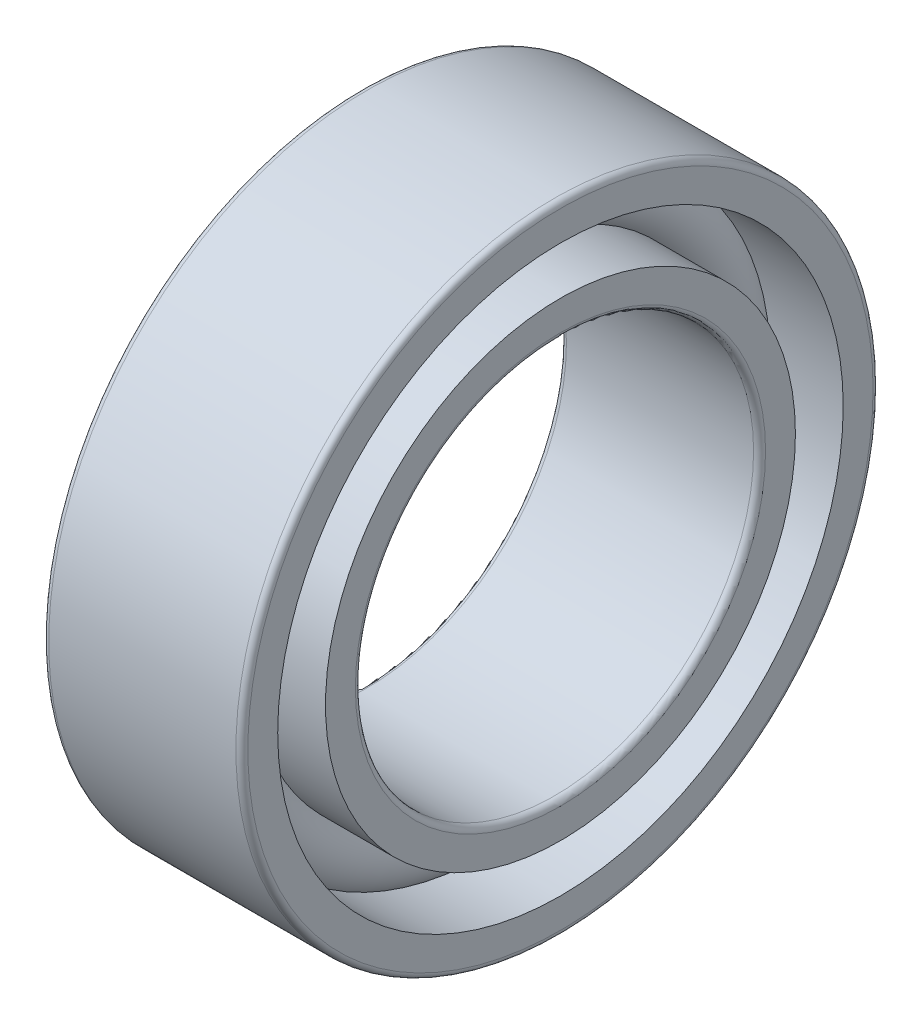
ISO-10303-21;
HEADER;
FILE_DESCRIPTION(('STEP AP214'),'2;1');
FILE_NAME('part.step','',(''),(''),'','','');
FILE_SCHEMA(('AUTOMOTIVE_DESIGN { 1 0 10303 214 1 1 1 1 }'));
ENDSEC;
DATA;
#1=APPLICATION_CONTEXT('core data for automotive mechanical design processes');
#2=APPLICATION_PROTOCOL_DEFINITION('international standard','automotive_design',2000,#1);
#3=PRODUCT_CONTEXT('',#1,'mechanical');
#4=PRODUCT('Part','Part','',(#3));
#5=PRODUCT_RELATED_PRODUCT_CATEGORY('part','',(#4));
#6=PRODUCT_DEFINITION_FORMATION('','',#4);
#7=PRODUCT_DEFINITION_CONTEXT('part definition',#1,'design');
#8=PRODUCT_DEFINITION('design','',#6,#7);
#9=PRODUCT_DEFINITION_SHAPE('','',#8);
#10=(LENGTH_UNIT() NAMED_UNIT(*) SI_UNIT(.MILLI.,.METRE.));
#11=(NAMED_UNIT(*) PLANE_ANGLE_UNIT() SI_UNIT($,.RADIAN.));
#12=(NAMED_UNIT(*) SI_UNIT($,.STERADIAN.) SOLID_ANGLE_UNIT());
#13=UNCERTAINTY_MEASURE_WITH_UNIT(LENGTH_MEASURE(1.E-05),#10,'distance_accuracy_value','');
#14=(GEOMETRIC_REPRESENTATION_CONTEXT(3) GLOBAL_UNCERTAINTY_ASSIGNED_CONTEXT((#13)) GLOBAL_UNIT_ASSIGNED_CONTEXT((#10,
#11,#12)) REPRESENTATION_CONTEXT('',''));
#15=CARTESIAN_POINT('',(0.,0.,0.));
#16=DIRECTION('',(0.,0.,1.));
#17=DIRECTION('',(1.,0.,0.));
#18=AXIS2_PLACEMENT_3D('',#15,#16,#17);
#19=CARTESIAN_POINT('',(0.,0.,0.));
#20=DIRECTION('',(-0.999999999999999,0.,0.));
#21=DIRECTION('',(0.,0.,0.999999999999999));
#22=AXIS2_PLACEMENT_3D('',#19,#20,#21);
#23=TOROIDAL_SURFACE('',#22,13.,1.8);
#24=CARTESIAN_POINT('',(1.34164078649976,0.,0.));
#25=DIRECTION('',(-0.999999999999999,0.,0.));
#26=DIRECTION('',(0.,0.,0.999999999999999));
#27=AXIS2_PLACEMENT_3D('',#24,#25,#26);
#28=CIRCLE('',#27,14.2);
#29=CARTESIAN_POINT('',(1.34164078649976,0.,-14.2000000000001));
#30=VERTEX_POINT('',#29);
#31=EDGE_CURVE('E39',#30,#30,#28,.F.);
#32=ORIENTED_EDGE('',*,*,#31,.T.);
#33=EDGE_LOOP('',(#32));
#34=FACE_BOUND('',#33,.T.);
#35=CARTESIAN_POINT('',(1.34164078649976,0.,0.));
#36=DIRECTION('',(-0.999999999999999,0.,0.));
#37=DIRECTION('',(0.,0.,0.999999999999999));
#38=AXIS2_PLACEMENT_3D('',#35,#36,#37);
#39=CIRCLE('',#38,11.8);
#40=CARTESIAN_POINT('',(1.34164078649976,0.,-11.8000000000002));
#41=VERTEX_POINT('',#40);
#42=EDGE_CURVE('E10',#41,#41,#39,.T.);
#43=ORIENTED_EDGE('',*,*,#42,.T.);
#44=EDGE_LOOP('',(#43));
#45=FACE_BOUND('',#44,.T.);
#46=ADVANCED_FACE('F35',(#34,#45),#23,.T.);
#47=CARTESIAN_POINT('',(-20.6374999999999,0.,-1.66533453693773E-13));
#48=DIRECTION('',(0.999999999999999,0.,0.));
#49=DIRECTION('',(0.,0.,-0.999999999999999));
#50=AXIS2_PLACEMENT_3D('',#47,#48,#49);
#51=CYLINDRICAL_SURFACE('',#50,11.8);
#52=CARTESIAN_POINT('',(5.00000000000007,0.,-1.66533453693773E-13));
#53=DIRECTION('',(0.999999999999999,0.,0.));
#54=DIRECTION('',(0.,0.,-0.999999999999999));
#55=AXIS2_PLACEMENT_3D('',#52,#53,#54);
#56=CIRCLE('',#55,11.8);
#57=CARTESIAN_POINT('',(5.00000000000007,0.,-11.8000000000002));
#58=VERTEX_POINT('',#57);
#59=EDGE_CURVE('E48',#58,#58,#56,.T.);
#60=CARTESIAN_POINT('',(5.00000000000007,0.,-11.8000000000002));
#61=CARTESIAN_POINT('',(4.96189209152611,0.,-11.8000000000002));
#62=CARTESIAN_POINT('',(4.92378418305215,0.,-11.8000000000002));
#63=CARTESIAN_POINT('',(4.84756836610423,0.,-11.8000000000002));
#64=CARTESIAN_POINT('',(4.80946045763026,0.,-11.8000000000002));
#65=CARTESIAN_POINT('',(4.73324464068234,0.,-11.8000000000002));
#66=CARTESIAN_POINT('',(4.69513673220838,0.,-11.8000000000002));
#67=CARTESIAN_POINT('',(4.61892091526046,0.,-11.8000000000002));
#68=CARTESIAN_POINT('',(4.58081300678649,0.,-11.8000000000002));
#69=CARTESIAN_POINT('',(4.50459718983857,0.,-11.8000000000002));
#70=CARTESIAN_POINT('',(4.46648928136461,0.,-11.8000000000002));
#71=CARTESIAN_POINT('',(4.39027346441669,0.,-11.8000000000002));
#72=CARTESIAN_POINT('',(4.35216555594272,0.,-11.8000000000002));
#73=CARTESIAN_POINT('',(4.2759497389948,0.,-11.8000000000002));
#74=CARTESIAN_POINT('',(4.23784183052084,0.,-11.8000000000002));
#75=CARTESIAN_POINT('',(4.16162601357292,0.,-11.8000000000002));
#76=CARTESIAN_POINT('',(4.12351810509896,0.,-11.8000000000002));
#77=CARTESIAN_POINT('',(4.04730228815103,0.,-11.8000000000002));
#78=CARTESIAN_POINT('',(4.00919437967707,0.,-11.8000000000002));
#79=CARTESIAN_POINT('',(3.93297856272915,0.,-11.8000000000002));
#80=CARTESIAN_POINT('',(3.89487065425519,0.,-11.8000000000002));
#81=CARTESIAN_POINT('',(3.81865483730727,0.,-11.8000000000002));
#82=CARTESIAN_POINT('',(3.7805469288333,0.,-11.8000000000002));
#83=CARTESIAN_POINT('',(3.70433111188538,0.,-11.8000000000002));
#84=CARTESIAN_POINT('',(3.66622320341142,0.,-11.8000000000002));
#85=CARTESIAN_POINT('',(3.5900073864635,0.,-11.8000000000002));
#86=CARTESIAN_POINT('',(3.55189947798953,0.,-11.8000000000002));
#87=CARTESIAN_POINT('',(3.47568366104161,0.,-11.8000000000002));
#88=CARTESIAN_POINT('',(3.43757575256765,0.,-11.8000000000002));
#89=CARTESIAN_POINT('',(3.36135993561973,0.,-11.8000000000002));
#90=CARTESIAN_POINT('',(3.32325202714576,0.,-11.8000000000002));
#91=CARTESIAN_POINT('',(3.24703621019784,0.,-11.8000000000002));
#92=CARTESIAN_POINT('',(3.20892830172388,0.,-11.8000000000002));
#93=CARTESIAN_POINT('',(3.13271248477595,0.,-11.8000000000002));
#94=CARTESIAN_POINT('',(3.09460457630199,0.,-11.8000000000002));
#95=CARTESIAN_POINT('',(3.01838875935407,0.,-11.8000000000002));
#96=CARTESIAN_POINT('',(2.98028085088011,0.,-11.8000000000002));
#97=CARTESIAN_POINT('',(2.90406503393218,0.,-11.8000000000002));
#98=CARTESIAN_POINT('',(2.86595712545822,0.,-11.8000000000002));
#99=CARTESIAN_POINT('',(2.7897413085103,0.,-11.8000000000002));
#100=CARTESIAN_POINT('',(2.75163340003634,0.,-11.8000000000002));
#101=CARTESIAN_POINT('',(2.67541758308841,0.,-11.8000000000002));
#102=CARTESIAN_POINT('',(2.63730967461445,0.,-11.8000000000002));
#103=CARTESIAN_POINT('',(2.56109385766653,0.,-11.8000000000002));
#104=CARTESIAN_POINT('',(2.52298594919257,0.,-11.8000000000002));
#105=CARTESIAN_POINT('',(2.44677013224464,0.,-11.8000000000002));
#106=CARTESIAN_POINT('',(2.40866222377068,0.,-11.8000000000002));
#107=CARTESIAN_POINT('',(2.33244640682276,0.,-11.8000000000002));
#108=CARTESIAN_POINT('',(2.2943384983488,0.,-11.8000000000002));
#109=CARTESIAN_POINT('',(2.21812268140087,0.,-11.8000000000002));
#110=CARTESIAN_POINT('',(2.18001477292691,0.,-11.8000000000002));
#111=CARTESIAN_POINT('',(2.10379895597899,0.,-11.8000000000002));
#112=CARTESIAN_POINT('',(2.06569104750503,0.,-11.8000000000002));
#113=CARTESIAN_POINT('',(1.98947523055711,0.,-11.8000000000002));
#114=CARTESIAN_POINT('',(1.95136732208314,0.,-11.8000000000002));
#115=CARTESIAN_POINT('',(1.87515150513522,0.,-11.8000000000002));
#116=CARTESIAN_POINT('',(1.83704359666126,0.,-11.8000000000002));
#117=CARTESIAN_POINT('',(1.76082777971334,0.,-11.8000000000002));
#118=CARTESIAN_POINT('',(1.72271987123937,0.,-11.8000000000002));
#119=CARTESIAN_POINT('',(1.64650405429145,0.,-11.8000000000002));
#120=CARTESIAN_POINT('',(1.60839614581749,0.,-11.8000000000002));
#121=CARTESIAN_POINT('',(1.53218032886957,0.,-11.8000000000002));
#122=CARTESIAN_POINT('',(1.49407242039561,0.,-11.8000000000002));
#123=CARTESIAN_POINT('',(1.41785660344768,0.,-11.8000000000002));
#124=CARTESIAN_POINT('',(1.37974869497372,0.,-11.8000000000002));
#125=CARTESIAN_POINT('',(1.34164078649976,0.,-11.8000000000002));
#126=B_SPLINE_CURVE_WITH_KNOTS('',3,(#60,#61,#62,#63,#64,#65,#66,#67,#68,#69,#70,#71,#72,#73,
#74,#75,#76,#77,#78,#79,#80,#81,#82,#83,#84,#85,#86,#87,#88,#89,#90,#91,#92,#93,#94,#95,#96,#97,
#98,#99,#100,#101,#102,#103,#104,#105,#106,#107,#108,#109,#110,#111,#112,#113,#114,#115,#116,
#117,#118,#119,#120,#121,#122,#123,#124,#125),.UNSPECIFIED.,.F.,.F.,(4,2,2,2,2,2,2,2,2,2,2,2,2,
2,2,2,2,2,2,2,2,2,2,2,2,2,2,2,2,2,2,2,4),(0.,0.114323725421885,0.228647450843771,
0.342971176265656,0.457294901687541,0.571618627109426,0.685942352531312,0.800266077953197,
0.914589803375079,1.02891352879696,1.14323725421885,1.25756097964073,1.37188470506262,
1.4862084304845,1.60053215590639,1.71485588132827,1.82917960675016,1.94350333217204,
2.05782705759393,2.17215078301581,2.2864745084377,2.40079823385958,2.51512195928147,
2.62944568470335,2.74376941012524,2.85809313554712,2.97241686096901,3.08674058639089,
3.20106431181278,3.31538803723466,3.42971176265655,3.54403548807843,3.65835921350031),.UNSPECIFIED.);
#127=EDGE_CURVE('BSEAM87',#58,#41,#126,.T.);
#128=ORIENTED_EDGE('',*,*,#59,.F.);
#129=ORIENTED_EDGE('',*,*,#42,.F.);
#130=ORIENTED_EDGE('',*,*,#127,.T.);
#131=ORIENTED_EDGE('',*,*,#127,.F.);
#132=EDGE_LOOP('',(#128,#130,#129,#131));
#133=FACE_BOUND('',#132,.T.);
#134=ADVANCED_FACE('F87',(#133),#51,.T.);
#135=CARTESIAN_POINT('',(-20.6374999999999,0.,-1.66533453693773E-13));
#136=DIRECTION('',(0.999999999999999,0.,0.));
#137=DIRECTION('',(0.,0.,-0.999999999999999));
#138=AXIS2_PLACEMENT_3D('',#135,#136,#137);
#139=CYLINDRICAL_SURFACE('',#138,11.8);
#140=CARTESIAN_POINT('',(-4.99999999999975,0.,0.));
#141=DIRECTION('',(0.999999999999999,0.,0.));
#142=DIRECTION('',(0.,0.,-0.999999999999999));
#143=AXIS2_PLACEMENT_3D('',#140,#141,#142);
#144=CIRCLE('',#143,11.8);
#145=CARTESIAN_POINT('',(-4.99999999999975,0.,-11.8000000000002));
#146=VERTEX_POINT('',#145);
#147=EDGE_CURVE('E57',#146,#146,#144,.T.);
#148=CARTESIAN_POINT('',(-1.34164078649959,0.,-1.94289029309402E-13));
#149=DIRECTION('',(0.999999999999999,0.,0.));
#150=DIRECTION('',(0.,0.,-0.999999999999999));
#151=AXIS2_PLACEMENT_3D('',#148,#149,#150);
#152=CIRCLE('',#151,11.8);
#153=CARTESIAN_POINT('',(-1.34164078649959,0.,-11.8000000000002));
#154=VERTEX_POINT('',#153);
#155=EDGE_CURVE('E43',#154,#154,#152,.T.);
#156=CARTESIAN_POINT('',(-4.99999999999975,0.,-11.8000000000002));
#157=CARTESIAN_POINT('',(-4.96189209152579,0.,-11.8000000000002));
#158=CARTESIAN_POINT('',(-4.92378418305183,0.,-11.8000000000002));
#159=CARTESIAN_POINT('',(-4.84756836610391,0.,-11.8000000000002));
#160=CARTESIAN_POINT('',(-4.80946045762995,0.,-11.8000000000002));
#161=CARTESIAN_POINT('',(-4.73324464068203,0.,-11.8000000000002));
#162=CARTESIAN_POINT('',(-4.69513673220807,0.,-11.8000000000002));
#163=CARTESIAN_POINT('',(-4.61892091526015,0.,-11.8000000000002));
#164=CARTESIAN_POINT('',(-4.58081300678619,0.,-11.8000000000002));
#165=CARTESIAN_POINT('',(-4.50459718983827,0.,-11.8000000000002));
#166=CARTESIAN_POINT('',(-4.46648928136431,0.,-11.8000000000002));
#167=CARTESIAN_POINT('',(-4.39027346441639,0.,-11.8000000000002));
#168=CARTESIAN_POINT('',(-4.35216555594243,0.,-11.8000000000002));
#169=CARTESIAN_POINT('',(-4.27594973899451,0.,-11.8000000000002));
#170=CARTESIAN_POINT('',(-4.23784183052055,0.,-11.8000000000002));
#171=CARTESIAN_POINT('',(-4.16162601357263,0.,-11.8000000000002));
#172=CARTESIAN_POINT('',(-4.12351810509867,0.,-11.8000000000002));
#173=CARTESIAN_POINT('',(-4.04730228815075,0.,-11.8000000000002));
#174=CARTESIAN_POINT('',(-4.00919437967679,0.,-11.8000000000002));
#175=CARTESIAN_POINT('',(-3.93297856272887,0.,-11.8000000000002));
#176=CARTESIAN_POINT('',(-3.89487065425491,0.,-11.8000000000002));
#177=CARTESIAN_POINT('',(-3.81865483730699,0.,-11.8000000000002));
#178=CARTESIAN_POINT('',(-3.78054692883303,0.,-11.8000000000002));
#179=CARTESIAN_POINT('',(-3.70433111188511,0.,-11.8000000000002));
#180=CARTESIAN_POINT('',(-3.66622320341115,0.,-11.8000000000002));
#181=CARTESIAN_POINT('',(-3.59000738646323,0.,-11.8000000000002));
#182=CARTESIAN_POINT('',(-3.55189947798927,0.,-11.8000000000002));
#183=CARTESIAN_POINT('',(-3.47568366104136,0.,-11.8000000000002));
#184=CARTESIAN_POINT('',(-3.43757575256739,0.,-11.8000000000002));
#185=CARTESIAN_POINT('',(-3.36135993561947,0.,-11.8000000000002));
#186=CARTESIAN_POINT('',(-3.32325202714552,0.,-11.8000000000002));
#187=CARTESIAN_POINT('',(-3.24703621019759,0.,-11.8000000000002));
#188=CARTESIAN_POINT('',(-3.20892830172363,0.,-11.8000000000002));
#189=CARTESIAN_POINT('',(-3.13271248477571,0.,-11.8000000000002));
#190=CARTESIAN_POINT('',(-3.09460457630175,0.,-11.8000000000002));
#191=CARTESIAN_POINT('',(-3.01838875935383,0.,-11.8000000000002));
#192=CARTESIAN_POINT('',(-2.98028085087987,0.,-11.8000000000002));
#193=CARTESIAN_POINT('',(-2.90406503393195,0.,-11.8000000000002));
#194=CARTESIAN_POINT('',(-2.86595712545799,0.,-11.8000000000002));
#195=CARTESIAN_POINT('',(-2.78974130851007,0.,-11.8000000000002));
#196=CARTESIAN_POINT('',(-2.75163340003611,0.,-11.8000000000002));
#197=CARTESIAN_POINT('',(-2.67541758308819,0.,-11.8000000000002));
#198=CARTESIAN_POINT('',(-2.63730967461423,0.,-11.8000000000002));
#199=CARTESIAN_POINT('',(-2.56109385766631,0.,-11.8000000000002));
#200=CARTESIAN_POINT('',(-2.52298594919235,0.,-11.8000000000002));
#201=CARTESIAN_POINT('',(-2.44677013224443,0.,-11.8000000000002));
#202=CARTESIAN_POINT('',(-2.40866222377047,0.,-11.8000000000002));
#203=CARTESIAN_POINT('',(-2.33244640682255,0.,-11.8000000000002));
#204=CARTESIAN_POINT('',(-2.29433849834859,0.,-11.8000000000002));
#205=CARTESIAN_POINT('',(-2.21812268140067,0.,-11.8000000000002));
#206=CARTESIAN_POINT('',(-2.18001477292671,0.,-11.8000000000002));
#207=CARTESIAN_POINT('',(-2.10379895597879,0.,-11.8000000000002));
#208=CARTESIAN_POINT('',(-2.06569104750483,0.,-11.8000000000002));
#209=CARTESIAN_POINT('',(-1.98947523055691,0.,-11.8000000000002));
#210=CARTESIAN_POINT('',(-1.95136732208295,0.,-11.8000000000002));
#211=CARTESIAN_POINT('',(-1.87515150513503,0.,-11.8000000000002));
#212=CARTESIAN_POINT('',(-1.83704359666107,0.,-11.8000000000002));
#213=CARTESIAN_POINT('',(-1.76082777971315,0.,-11.8000000000002));
#214=CARTESIAN_POINT('',(-1.72271987123919,0.,-11.8000000000002));
#215=CARTESIAN_POINT('',(-1.64650405429127,0.,-11.8000000000002));
#216=CARTESIAN_POINT('',(-1.60839614581731,0.,-11.8000000000002));
#217=CARTESIAN_POINT('',(-1.53218032886939,0.,-11.8000000000002));
#218=CARTESIAN_POINT('',(-1.49407242039543,0.,-11.8000000000002));
#219=CARTESIAN_POINT('',(-1.41785660344751,0.,-11.8000000000002));
#220=CARTESIAN_POINT('',(-1.37974869497355,0.,-11.8000000000002));
#221=CARTESIAN_POINT('',(-1.34164078649959,0.,-11.8000000000002));
#222=B_SPLINE_CURVE_WITH_KNOTS('',3,(#156,#157,#158,#159,#160,#161,#162,#163,#164,#165,#166,
#167,#168,#169,#170,#171,#172,#173,#174,#175,#176,#177,#178,#179,#180,#181,#182,#183,#184,#185,
#186,#187,#188,#189,#190,#191,#192,#193,#194,#195,#196,#197,#198,#199,#200,#201,#202,#203,#204,
#205,#206,#207,#208,#209,#210,#211,#212,#213,#214,#215,#216,#217,#218,#219,#220,#221),
.UNSPECIFIED.,.F.,.F.,(4,2,2,2,2,2,2,2,2,2,2,2,2,2,2,2,2,2,2,2,2,2,2,2,2,2,2,2,2,2,2,2,4),(0.,
0.114323725421882,0.22864745084376,0.342971176265642,0.45729490168752,0.571618627109402,
0.68594235253128,0.800266077953162,0.91458980337504,1.02891352879692,1.1432372542188,
1.25756097964068,1.37188470506256,1.48620843048444,1.60053215590632,1.7148558813282,
1.82917960675008,1.94350333217196,2.05782705759384,2.17215078301572,2.2864745084376,
2.40079823385948,2.51512195928136,2.62944568470324,2.74376941012512,2.858093135547,
2.97241686096889,3.08674058639076,3.20106431181265,3.31538803723452,3.42971176265641,
3.54403548807828,3.65835921350017),.UNSPECIFIED.);
#223=EDGE_CURVE('BSEAM90',#146,#154,#222,.T.);
#224=ORIENTED_EDGE('',*,*,#147,.T.);
#225=ORIENTED_EDGE('',*,*,#155,.F.);
#226=ORIENTED_EDGE('',*,*,#223,.T.);
#227=ORIENTED_EDGE('',*,*,#223,.F.);
#228=EDGE_LOOP('',(#224,#226,#225,#227));
#229=FACE_BOUND('',#228,.T.);
#230=ADVANCED_FACE('F90',(#229),#139,.T.);
#231=CARTESIAN_POINT('',(5.00000000000003,10.3,-1.66533453693773E-13));
#232=DIRECTION('',(0.999999999999999,0.,0.));
#233=DIRECTION('',(0.,0.,-0.999999999999999));
#234=AXIS2_PLACEMENT_3D('',#231,#232,#233);
#235=PLANE('',#234);
#236=ORIENTED_EDGE('',*,*,#59,.T.);
#237=EDGE_LOOP('',(#236));
#238=FACE_BOUND('',#237,.T.);
#239=CARTESIAN_POINT('',(5.00000000000007,0.,-1.66533453693773E-13));
#240=DIRECTION('',(0.999999999999999,0.,0.));
#241=DIRECTION('',(0.,0.,-0.999999999999999));
#242=AXIS2_PLACEMENT_3D('',#239,#240,#241);
#243=CIRCLE('',#242,10.3);
#244=CARTESIAN_POINT('',(5.00000000000007,0.,-10.3000000000001));
#245=VERTEX_POINT('',#244);
#246=EDGE_CURVE('E79',#245,#245,#243,.T.);
#247=ORIENTED_EDGE('',*,*,#246,.F.);
#248=EDGE_LOOP('',(#247));
#249=FACE_BOUND('',#248,.T.);
#250=ADVANCED_FACE('F84',(#238,#249),#235,.T.);
#251=CARTESIAN_POINT('',(4.70000000000011,0.,-1.94289029309402E-13));
#252=DIRECTION('',(0.999999999999999,0.,0.));
#253=DIRECTION('',(0.,0.,-0.999999999999999));
#254=AXIS2_PLACEMENT_3D('',#251,#252,#253);
#255=TOROIDAL_SURFACE('',#254,10.3,0.299999999999981);
#256=ORIENTED_EDGE('',*,*,#246,.T.);
#257=EDGE_LOOP('',(#256));
#258=FACE_BOUND('',#257,.T.);
#259=CARTESIAN_POINT('',(4.70000000000011,0.,-1.94289029309402E-13));
#260=DIRECTION('',(0.999999999999999,0.,0.));
#261=DIRECTION('',(0.,0.,-0.999999999999999));
#262=AXIS2_PLACEMENT_3D('',#259,#260,#261);
#263=CIRCLE('',#262,10.);
#264=CARTESIAN_POINT('',(4.70000000000011,0.,-10.0000000000002));
#265=VERTEX_POINT('',#264);
#266=EDGE_CURVE('E76',#265,#265,#263,.T.);
#267=ORIENTED_EDGE('',*,*,#266,.F.);
#268=EDGE_LOOP('',(#267));
#269=FACE_BOUND('',#268,.T.);
#270=ADVANCED_FACE('F101',(#258,#269),#255,.T.);
#271=CARTESIAN_POINT('',(-20.6374999999999,0.,-1.66533453693773E-13));
#272=DIRECTION('',(0.999999999999999,0.,0.));
#273=DIRECTION('',(0.,0.,-0.999999999999999));
#274=AXIS2_PLACEMENT_3D('',#271,#272,#273);
#275=CYLINDRICAL_SURFACE('',#274,10.);
#276=CARTESIAN_POINT('',(-4.69999999999968,0.,0.));
#277=DIRECTION('',(0.999999999999999,0.,0.));
#278=DIRECTION('',(0.,0.,-0.999999999999999));
#279=AXIS2_PLACEMENT_3D('',#276,#277,#278);
#280=CIRCLE('',#279,9.99999999999999);
#281=CARTESIAN_POINT('',(-4.69999999999968,0.,-10.0000000000002));
#282=VERTEX_POINT('',#281);
#283=EDGE_CURVE('E73',#282,#282,#280,.T.);
#284=CARTESIAN_POINT('',(4.70000000000011,0.,-10.0000000000002));
#285=CARTESIAN_POINT('',(4.60208333333344,0.,-10.0000000000002));
#286=CARTESIAN_POINT('',(4.50416666666678,0.,-10.0000000000002));
#287=CARTESIAN_POINT('',(4.30833333333345,0.,-10.0000000000002));
#288=CARTESIAN_POINT('',(4.21041666666678,0.,-10.0000000000002));
#289=CARTESIAN_POINT('',(4.01458333333346,0.,-10.0000000000002));
#290=CARTESIAN_POINT('',(3.91666666666679,0.,-10.0000000000002));
#291=CARTESIAN_POINT('',(3.72083333333347,0.,-10.0000000000002));
#292=CARTESIAN_POINT('',(3.6229166666668,0.,-10.0000000000002));
#293=CARTESIAN_POINT('',(3.42708333333347,0.,-10.0000000000002));
#294=CARTESIAN_POINT('',(3.32916666666681,0.,-10.0000000000002));
#295=CARTESIAN_POINT('',(3.13333333333348,0.,-10.0000000000002));
#296=CARTESIAN_POINT('',(3.03541666666681,0.,-10.0000000000002));
#297=CARTESIAN_POINT('',(2.83958333333348,0.,-10.0000000000002));
#298=CARTESIAN_POINT('',(2.74166666666682,0.,-10.0000000000002));
#299=CARTESIAN_POINT('',(2.54583333333349,0.,-10.0000000000002));
#300=CARTESIAN_POINT('',(2.44791666666683,0.,-10.0000000000002));
#301=CARTESIAN_POINT('',(2.2520833333335,0.,-10.0000000000002));
#302=CARTESIAN_POINT('',(2.15416666666683,0.,-10.0000000000002));
#303=CARTESIAN_POINT('',(1.9583333333335,0.,-10.0000000000002));
#304=CARTESIAN_POINT('',(1.86041666666684,0.,-10.0000000000002));
#305=CARTESIAN_POINT('',(1.66458333333351,0.,-10.0000000000002));
#306=CARTESIAN_POINT('',(1.56666666666685,0.,-10.0000000000002));
#307=CARTESIAN_POINT('',(1.37083333333352,0.,-10.0000000000002));
#308=CARTESIAN_POINT('',(1.27291666666685,0.,-10.0000000000002));
#309=CARTESIAN_POINT('',(1.07708333333352,0.,-10.0000000000002));
#310=CARTESIAN_POINT('',(0.97916666666686,0.,-10.0000000000002));
#311=CARTESIAN_POINT('',(0.78333333333353,0.,-10.0000000000002));
#312=CARTESIAN_POINT('',(0.685416666666866,0.,-10.0000000000002));
#313=CARTESIAN_POINT('',(0.489583333333538,0.,-10.0000000000002));
#314=CARTESIAN_POINT('',(0.391666666666874,0.,-10.0000000000002));
#315=CARTESIAN_POINT('',(0.195833333333545,0.,-10.0000000000002));
#316=CARTESIAN_POINT('',(0.0979166666668803,0.,-10.0000000000002));
#317=CARTESIAN_POINT('',(-0.0979166666664501,0.,-10.0000000000002));
#318=CARTESIAN_POINT('',(-0.195833333333115,0.,-10.0000000000002));
#319=CARTESIAN_POINT('',(-0.391666666666444,0.,-10.0000000000002));
#320=CARTESIAN_POINT('',(-0.489583333333108,0.,-10.0000000000002));
#321=CARTESIAN_POINT('',(-0.685416666666436,0.,-10.0000000000002));
#322=CARTESIAN_POINT('',(-0.7833333333331,0.,-10.0000000000002));
#323=CARTESIAN_POINT('',(-0.979166666666428,0.,-10.0000000000002));
#324=CARTESIAN_POINT('',(-1.07708333333309,0.,-10.0000000000002));
#325=CARTESIAN_POINT('',(-1.27291666666642,0.,-10.0000000000002));
#326=CARTESIAN_POINT('',(-1.37083333333309,0.,-10.0000000000002));
#327=CARTESIAN_POINT('',(-1.56666666666642,0.,-10.0000000000002));
#328=CARTESIAN_POINT('',(-1.66458333333308,0.,-10.0000000000002));
#329=CARTESIAN_POINT('',(-1.86041666666641,0.,-10.0000000000002));
#330=CARTESIAN_POINT('',(-1.95833333333307,0.,-10.0000000000002));
#331=CARTESIAN_POINT('',(-2.1541666666664,0.,-10.0000000000002));
#332=CARTESIAN_POINT('',(-2.25208333333307,0.,-10.0000000000002));
#333=CARTESIAN_POINT('',(-2.4479166666664,0.,-10.0000000000002));
#334=CARTESIAN_POINT('',(-2.54583333333306,0.,-10.0000000000002));
#335=CARTESIAN_POINT('',(-2.74166666666639,0.,-10.0000000000002));
#336=CARTESIAN_POINT('',(-2.83958333333305,0.,-10.0000000000002));
#337=CARTESIAN_POINT('',(-3.03541666666638,0.,-10.0000000000002));
#338=CARTESIAN_POINT('',(-3.13333333333305,0.,-10.0000000000002));
#339=CARTESIAN_POINT('',(-3.32916666666637,0.,-10.0000000000002));
#340=CARTESIAN_POINT('',(-3.42708333333304,0.,-10.0000000000002));
#341=CARTESIAN_POINT('',(-3.62291666666637,0.,-10.0000000000002));
#342=CARTESIAN_POINT('',(-3.72083333333303,0.,-10.0000000000002));
#343=CARTESIAN_POINT('',(-3.91666666666636,0.,-10.0000000000002));
#344=CARTESIAN_POINT('',(-4.01458333333303,0.,-10.0000000000002));
#345=CARTESIAN_POINT('',(-4.21041666666635,0.,-10.0000000000002));
#346=CARTESIAN_POINT('',(-4.30833333333302,0.,-10.0000000000002));
#347=CARTESIAN_POINT('',(-4.50416666666635,0.,-10.0000000000002));
#348=CARTESIAN_POINT('',(-4.60208333333301,0.,-10.0000000000002));
#349=CARTESIAN_POINT('',(-4.69999999999968,0.,-10.0000000000002));
#350=B_SPLINE_CURVE_WITH_KNOTS('',3,(#284,#285,#286,#287,#288,#289,#290,#291,#292,#293,#294,
#295,#296,#297,#298,#299,#300,#301,#302,#303,#304,#305,#306,#307,#308,#309,#310,#311,#312,#313,
#314,#315,#316,#317,#318,#319,#320,#321,#322,#323,#324,#325,#326,#327,#328,#329,#330,#331,#332,
#333,#334,#335,#336,#337,#338,#339,#340,#341,#342,#343,#344,#345,#346,#347,#348,#349),
.UNSPECIFIED.,.F.,.F.,(4,2,2,2,2,2,2,2,2,2,2,2,2,2,2,2,2,2,2,2,2,2,2,2,2,2,2,2,2,2,2,2,4),(0.,
0.293749999999995,0.587499999999987,0.881249999999976,1.17499999999997,1.46874999999997,
1.76249999999996,2.05624999999995,2.34999999999995,2.64374999999994,2.93749999999993,
3.23124999999992,3.52499999999992,3.81874999999991,4.1124999999999,4.4062499999999,
4.69999999999989,4.99374999999989,5.28749999999988,5.58124999999987,5.87499999999986,
6.16874999999986,6.46249999999985,6.75624999999984,7.04999999999984,7.34374999999983,
7.63749999999983,7.93124999999982,8.22499999999981,8.5187499999998,8.8124999999998,
9.10624999999979,9.39999999999978),.UNSPECIFIED.);
#351=EDGE_CURVE('BSEAM104',#265,#282,#350,.T.);
#352=ORIENTED_EDGE('',*,*,#266,.T.);
#353=ORIENTED_EDGE('',*,*,#283,.F.);
#354=ORIENTED_EDGE('',*,*,#351,.T.);
#355=ORIENTED_EDGE('',*,*,#351,.F.);
#356=EDGE_LOOP('',(#352,#354,#353,#355));
#357=FACE_BOUND('',#356,.T.);
#358=ADVANCED_FACE('F104',(#357),#275,.F.);
#359=CARTESIAN_POINT('',(-4.69999999999968,0.,0.));
#360=DIRECTION('',(0.999999999999999,0.,0.));
#361=DIRECTION('',(0.,0.,-0.999999999999999));
#362=AXIS2_PLACEMENT_3D('',#359,#360,#361);
#363=TOROIDAL_SURFACE('',#362,10.3,0.299999999999981);
#364=ORIENTED_EDGE('',*,*,#283,.T.);
#365=EDGE_LOOP('',(#364));
#366=FACE_BOUND('',#365,.T.);
#367=CARTESIAN_POINT('',(-4.99999999999975,0.,0.));
#368=DIRECTION('',(0.999999999999999,0.,0.));
#369=DIRECTION('',(0.,0.,-0.999999999999999));
#370=AXIS2_PLACEMENT_3D('',#367,#368,#369);
#371=CIRCLE('',#370,10.3);
#372=CARTESIAN_POINT('',(-4.99999999999975,0.,-10.3));
#373=VERTEX_POINT('',#372);
#374=EDGE_CURVE('E70',#373,#373,#371,.T.);
#375=ORIENTED_EDGE('',*,*,#374,.F.);
#376=EDGE_LOOP('',(#375));
#377=FACE_BOUND('',#376,.T.);
#378=ADVANCED_FACE('F108',(#366,#377),#363,.T.);
#379=CARTESIAN_POINT('',(-4.99999999999974,11.8,-1.66533453693773E-13));
#380=DIRECTION('',(-0.999999999999999,0.,0.));
#381=DIRECTION('',(0.,0.,0.999999999999999));
#382=AXIS2_PLACEMENT_3D('',#379,#380,#381);
#383=PLANE('',#382);
#384=ORIENTED_EDGE('',*,*,#374,.T.);
#385=EDGE_LOOP('',(#384));
#386=FACE_BOUND('',#385,.T.);
#387=ORIENTED_EDGE('',*,*,#147,.F.);
#388=EDGE_LOOP('',(#387));
#389=FACE_BOUND('',#388,.T.);
#390=ADVANCED_FACE('F112',(#386,#389),#383,.T.);
#391=CARTESIAN_POINT('',(-1.34164078649959,0.,-1.94289029309402E-13));
#392=DIRECTION('',(0.999999999999999,0.,0.));
#393=DIRECTION('',(0.,0.,-0.999999999999999));
#394=AXIS2_PLACEMENT_3D('',#391,#392,#393);
#395=CIRCLE('',#394,14.2);
#396=CARTESIAN_POINT('',(-1.34164078649959,0.,-14.2000000000001));
#397=VERTEX_POINT('',#396);
#398=EDGE_CURVE('E51',#397,#397,#395,.F.);
#399=ORIENTED_EDGE('',*,*,#398,.T.);
#400=EDGE_LOOP('',(#399));
#401=FACE_BOUND('',#400,.T.);
#402=ORIENTED_EDGE('',*,*,#155,.T.);
#403=EDGE_LOOP('',(#402));
#404=FACE_BOUND('',#403,.T.);
#405=ADVANCED_FACE('F37',(#401,#404),#23,.T.);
#406=CARTESIAN_POINT('',(-20.6374999999999,0.,-1.66533453693773E-13));
#407=DIRECTION('',(0.999999999999999,0.,0.));
#408=DIRECTION('',(0.,0.,-0.999999999999999));
#409=AXIS2_PLACEMENT_3D('',#406,#407,#408);
#410=CYLINDRICAL_SURFACE('',#409,14.2);
#411=CARTESIAN_POINT('',(5.00000000000018,0.,0.));
#412=DIRECTION('',(0.999999999999999,0.,0.));
#413=DIRECTION('',(0.,0.,-0.999999999999999));
#414=AXIS2_PLACEMENT_3D('',#411,#412,#413);
#415=CIRCLE('',#414,14.2);
#416=CARTESIAN_POINT('',(5.00000000000018,0.,-14.2000000000001));
#417=VERTEX_POINT('',#416);
#418=EDGE_CURVE('E53',#417,#417,#415,.T.);
#419=CARTESIAN_POINT('',(5.00000000000018,0.,-14.2000000000001));
#420=CARTESIAN_POINT('',(4.96189209152622,0.,-14.2000000000001));
#421=CARTESIAN_POINT('',(4.92378418305226,0.,-14.2000000000001));
#422=CARTESIAN_POINT('',(4.84756836610433,0.,-14.2000000000001));
#423=CARTESIAN_POINT('',(4.80946045763037,0.,-14.2000000000001));
#424=CARTESIAN_POINT('',(4.73324464068244,0.,-14.2000000000001));
#425=CARTESIAN_POINT('',(4.69513673220848,0.,-14.2000000000001));
#426=CARTESIAN_POINT('',(4.61892091526056,0.,-14.2000000000001));
#427=CARTESIAN_POINT('',(4.58081300678659,0.,-14.2000000000001));
#428=CARTESIAN_POINT('',(4.50459718983867,0.,-14.2000000000001));
#429=CARTESIAN_POINT('',(4.4664892813647,0.,-14.2000000000001));
#430=CARTESIAN_POINT('',(4.39027346441678,0.,-14.2000000000001));
#431=CARTESIAN_POINT('',(4.35216555594281,0.,-14.2000000000001));
#432=CARTESIAN_POINT('',(4.27594973899489,0.,-14.2000000000001));
#433=CARTESIAN_POINT('',(4.23784183052093,0.,-14.2000000000001));
#434=CARTESIAN_POINT('',(4.161626013573,0.,-14.2000000000001));
#435=CARTESIAN_POINT('',(4.12351810509904,0.,-14.2000000000001));
#436=CARTESIAN_POINT('',(4.04730228815112,0.,-14.2000000000001));
#437=CARTESIAN_POINT('',(4.00919437967715,0.,-14.2000000000001));
#438=CARTESIAN_POINT('',(3.93297856272923,0.,-14.2000000000001));
#439=CARTESIAN_POINT('',(3.89487065425527,0.,-14.2000000000001));
#440=CARTESIAN_POINT('',(3.81865483730734,0.,-14.2000000000001));
#441=CARTESIAN_POINT('',(3.78054692883338,0.,-14.2000000000001));
#442=CARTESIAN_POINT('',(3.70433111188545,0.,-14.2000000000001));
#443=CARTESIAN_POINT('',(3.66622320341149,0.,-14.2000000000001));
#444=CARTESIAN_POINT('',(3.59000738646356,0.,-14.2000000000001));
#445=CARTESIAN_POINT('',(3.5518994779896,0.,-14.2000000000001));
#446=CARTESIAN_POINT('',(3.47568366104168,0.,-14.2000000000001));
#447=CARTESIAN_POINT('',(3.43757575256771,0.,-14.2000000000001));
#448=CARTESIAN_POINT('',(3.36135993561979,0.,-14.2000000000001));
#449=CARTESIAN_POINT('',(3.32325202714582,0.,-14.2000000000001));
#450=CARTESIAN_POINT('',(3.2470362101979,0.,-14.2000000000001));
#451=CARTESIAN_POINT('',(3.20892830172393,0.,-14.2000000000001));
#452=CARTESIAN_POINT('',(3.13271248477601,0.,-14.2000000000001));
#453=CARTESIAN_POINT('',(3.09460457630205,0.,-14.2000000000001));
#454=CARTESIAN_POINT('',(3.01838875935412,0.,-14.2000000000001));
#455=CARTESIAN_POINT('',(2.98028085088016,0.,-14.2000000000001));
#456=CARTESIAN_POINT('',(2.90406503393223,0.,-14.2000000000001));
#457=CARTESIAN_POINT('',(2.86595712545827,0.,-14.2000000000001));
#458=CARTESIAN_POINT('',(2.78974130851034,0.,-14.2000000000001));
#459=CARTESIAN_POINT('',(2.75163340003638,0.,-14.2000000000001));
#460=CARTESIAN_POINT('',(2.67541758308845,0.,-14.2000000000001));
#461=CARTESIAN_POINT('',(2.63730967461449,0.,-14.2000000000001));
#462=CARTESIAN_POINT('',(2.56109385766657,0.,-14.2000000000001));
#463=CARTESIAN_POINT('',(2.5229859491926,0.,-14.2000000000001));
#464=CARTESIAN_POINT('',(2.44677013224468,0.,-14.2000000000001));
#465=CARTESIAN_POINT('',(2.40866222377072,0.,-14.2000000000001));
#466=CARTESIAN_POINT('',(2.33244640682279,0.,-14.2000000000001));
#467=CARTESIAN_POINT('',(2.29433849834883,0.,-14.2000000000001));
#468=CARTESIAN_POINT('',(2.2181226814009,0.,-14.2000000000001));
#469=CARTESIAN_POINT('',(2.18001477292694,0.,-14.2000000000001));
#470=CARTESIAN_POINT('',(2.10379895597901,0.,-14.2000000000001));
#471=CARTESIAN_POINT('',(2.06569104750505,0.,-14.2000000000001));
#472=CARTESIAN_POINT('',(1.98947523055713,0.,-14.2000000000001));
#473=CARTESIAN_POINT('',(1.95136732208316,0.,-14.2000000000001));
#474=CARTESIAN_POINT('',(1.87515150513524,0.,-14.2000000000001));
#475=CARTESIAN_POINT('',(1.83704359666127,0.,-14.2000000000001));
#476=CARTESIAN_POINT('',(1.76082777971335,0.,-14.2000000000001));
#477=CARTESIAN_POINT('',(1.72271987123938,0.,-14.2000000000001));
#478=CARTESIAN_POINT('',(1.64650405429146,0.,-14.2000000000001));
#479=CARTESIAN_POINT('',(1.6083961458175,0.,-14.2000000000001));
#480=CARTESIAN_POINT('',(1.53218032886957,0.,-14.2000000000001));
#481=CARTESIAN_POINT('',(1.49407242039561,0.,-14.2000000000001));
#482=CARTESIAN_POINT('',(1.41785660344769,0.,-14.2000000000001));
#483=CARTESIAN_POINT('',(1.37974869497372,0.,-14.2000000000001));
#484=CARTESIAN_POINT('',(1.34164078649976,0.,-14.2000000000001));
#485=B_SPLINE_CURVE_WITH_KNOTS('',3,(#419,#420,#421,#422,#423,#424,#425,#426,#427,#428,#429,
#430,#431,#432,#433,#434,#435,#436,#437,#438,#439,#440,#441,#442,#443,#444,#445,#446,#447,#448,
#449,#450,#451,#452,#453,#454,#455,#456,#457,#458,#459,#460,#461,#462,#463,#464,#465,#466,#467,
#468,#469,#470,#471,#472,#473,#474,#475,#476,#477,#478,#479,#480,#481,#482,#483,#484),
.UNSPECIFIED.,.F.,.F.,(4,2,2,2,2,2,2,2,2,2,2,2,2,2,2,2,2,2,2,2,2,2,2,2,2,2,2,2,2,2,2,2,4),(0.,
0.114323725421889,0.228647450843777,0.342971176265666,0.457294901687555,0.571618627109444,
0.685942352531332,0.800266077953221,0.914589803375106,1.02891352879699,1.14323725421888,
1.25756097964077,1.37188470506266,1.48620843048455,1.60053215590644,1.71485588132832,
1.82917960675021,1.9435033321721,2.05782705759399,2.17215078301588,2.28647450843777,
2.40079823385966,2.51512195928155,2.62944568470343,2.74376941012532,2.85809313554721,
2.9724168609691,3.08674058639099,3.20106431181287,3.31538803723476,3.42971176265665,
3.54403548807854,3.65835921350043),.UNSPECIFIED.);
#486=EDGE_CURVE('BSEAM117',#417,#30,#485,.T.);
#487=ORIENTED_EDGE('',*,*,#418,.T.);
#488=ORIENTED_EDGE('',*,*,#31,.F.);
#489=ORIENTED_EDGE('',*,*,#486,.T.);
#490=ORIENTED_EDGE('',*,*,#486,.F.);
#491=EDGE_LOOP('',(#487,#489,#488,#490));
#492=FACE_BOUND('',#491,.T.);
#493=ADVANCED_FACE('F117',(#492),#410,.F.);
#494=CARTESIAN_POINT('',(-20.6374999999999,0.,-1.66533453693773E-13));
#495=DIRECTION('',(0.999999999999999,0.,0.));
#496=DIRECTION('',(0.,0.,-0.999999999999999));
#497=AXIS2_PLACEMENT_3D('',#494,#495,#496);
#498=CYLINDRICAL_SURFACE('',#497,14.2);
#499=CARTESIAN_POINT('',(-4.99999999999987,0.,0.));
#500=DIRECTION('',(0.999999999999999,0.,0.));
#501=DIRECTION('',(0.,0.,-0.999999999999999));
#502=AXIS2_PLACEMENT_3D('',#499,#500,#501);
#503=CIRCLE('',#502,14.2);
#504=CARTESIAN_POINT('',(-4.99999999999987,0.,-14.2000000000001));
#505=VERTEX_POINT('',#504);
#506=EDGE_CURVE('E148',#505,#505,#503,.T.);
#507=CARTESIAN_POINT('',(-4.99999999999987,0.,-14.2000000000001));
#508=CARTESIAN_POINT('',(-4.9618920915259,0.,-14.2000000000001));
#509=CARTESIAN_POINT('',(-4.92378418305194,0.,-14.2000000000001));
#510=CARTESIAN_POINT('',(-4.84756836610402,0.,-14.2000000000001));
#511=CARTESIAN_POINT('',(-4.80946045763006,0.,-14.2000000000001));
#512=CARTESIAN_POINT('',(-4.73324464068214,0.,-14.2000000000001));
#513=CARTESIAN_POINT('',(-4.69513673220817,0.,-14.2000000000001));
#514=CARTESIAN_POINT('',(-4.61892091526025,0.,-14.2000000000001));
#515=CARTESIAN_POINT('',(-4.58081300678629,0.,-14.2000000000001));
#516=CARTESIAN_POINT('',(-4.50459718983837,0.,-14.2000000000001));
#517=CARTESIAN_POINT('',(-4.46648928136441,0.,-14.2000000000001));
#518=CARTESIAN_POINT('',(-4.39027346441649,0.,-14.2000000000001));
#519=CARTESIAN_POINT('',(-4.35216555594253,0.,-14.2000000000001));
#520=CARTESIAN_POINT('',(-4.2759497389946,0.,-14.2000000000001));
#521=CARTESIAN_POINT('',(-4.23784183052064,0.,-14.2000000000001));
#522=CARTESIAN_POINT('',(-4.16162601357272,0.,-14.2000000000001));
#523=CARTESIAN_POINT('',(-4.12351810509876,0.,-14.2000000000001));
#524=CARTESIAN_POINT('',(-4.04730228815084,0.,-14.2000000000001));
#525=CARTESIAN_POINT('',(-4.00919437967687,0.,-14.2000000000001));
#526=CARTESIAN_POINT('',(-3.93297856272895,0.,-14.2000000000001));
#527=CARTESIAN_POINT('',(-3.89487065425499,0.,-14.2000000000001));
#528=CARTESIAN_POINT('',(-3.81865483730707,0.,-14.2000000000001));
#529=CARTESIAN_POINT('',(-3.78054692883311,0.,-14.2000000000001));
#530=CARTESIAN_POINT('',(-3.70433111188518,0.,-14.2000000000001));
#531=CARTESIAN_POINT('',(-3.66622320341122,0.,-14.2000000000001));
#532=CARTESIAN_POINT('',(-3.5900073864633,0.,-14.2000000000001));
#533=CARTESIAN_POINT('',(-3.55189947798934,0.,-14.2000000000001));
#534=CARTESIAN_POINT('',(-3.47568366104142,0.,-14.2000000000001));
#535=CARTESIAN_POINT('',(-3.43757575256746,0.,-14.2000000000001));
#536=CARTESIAN_POINT('',(-3.36135993561954,0.,-14.2000000000001));
#537=CARTESIAN_POINT('',(-3.32325202714557,0.,-14.2000000000001));
#538=CARTESIAN_POINT('',(-3.24703621019765,0.,-14.2000000000001));
#539=CARTESIAN_POINT('',(-3.20892830172369,0.,-14.2000000000001));
#540=CARTESIAN_POINT('',(-3.13271248477577,0.,-14.2000000000001));
#541=CARTESIAN_POINT('',(-3.09460457630181,0.,-14.2000000000001));
#542=CARTESIAN_POINT('',(-3.01838875935388,0.,-14.2000000000001));
#543=CARTESIAN_POINT('',(-2.98028085087992,0.,-14.2000000000001));
#544=CARTESIAN_POINT('',(-2.904065033932,0.,-14.2000000000001));
#545=CARTESIAN_POINT('',(-2.86595712545804,0.,-14.2000000000001));
#546=CARTESIAN_POINT('',(-2.78974130851012,0.,-14.2000000000001));
#547=CARTESIAN_POINT('',(-2.75163340003616,0.,-14.2000000000001));
#548=CARTESIAN_POINT('',(-2.67541758308823,0.,-14.2000000000001));
#549=CARTESIAN_POINT('',(-2.63730967461427,0.,-14.2000000000001));
#550=CARTESIAN_POINT('',(-2.56109385766635,0.,-14.2000000000001));
#551=CARTESIAN_POINT('',(-2.52298594919239,0.,-14.2000000000001));
#552=CARTESIAN_POINT('',(-2.44677013224447,0.,-14.2000000000001));
#553=CARTESIAN_POINT('',(-2.4086622237705,0.,-14.2000000000001));
#554=CARTESIAN_POINT('',(-2.33244640682258,0.,-14.2000000000001));
#555=CARTESIAN_POINT('',(-2.29433849834862,0.,-14.2000000000001));
#556=CARTESIAN_POINT('',(-2.2181226814007,0.,-14.2000000000001));
#557=CARTESIAN_POINT('',(-2.18001477292674,0.,-14.2000000000001));
#558=CARTESIAN_POINT('',(-2.10379895597881,0.,-14.2000000000001));
#559=CARTESIAN_POINT('',(-2.06569104750485,0.,-14.2000000000001));
#560=CARTESIAN_POINT('',(-1.98947523055693,0.,-14.2000000000001));
#561=CARTESIAN_POINT('',(-1.95136732208297,0.,-14.2000000000001));
#562=CARTESIAN_POINT('',(-1.87515150513505,0.,-14.2000000000001));
#563=CARTESIAN_POINT('',(-1.83704359666109,0.,-14.2000000000001));
#564=CARTESIAN_POINT('',(-1.76082777971316,0.,-14.2000000000001));
#565=CARTESIAN_POINT('',(-1.7227198712392,0.,-14.2000000000001));
#566=CARTESIAN_POINT('',(-1.64650405429128,0.,-14.2000000000001));
#567=CARTESIAN_POINT('',(-1.60839614581732,0.,-14.2000000000001));
#568=CARTESIAN_POINT('',(-1.53218032886939,0.,-14.2000000000001));
#569=CARTESIAN_POINT('',(-1.49407242039543,0.,-14.2000000000001));
#570=CARTESIAN_POINT('',(-1.41785660344751,0.,-14.2000000000001));
#571=CARTESIAN_POINT('',(-1.37974869497355,0.,-14.2000000000001));
#572=CARTESIAN_POINT('',(-1.34164078649959,0.,-14.2000000000001));
#573=B_SPLINE_CURVE_WITH_KNOTS('',3,(#507,#508,#509,#510,#511,#512,#513,#514,#515,#516,#517,
#518,#519,#520,#521,#522,#523,#524,#525,#526,#527,#528,#529,#530,#531,#532,#533,#534,#535,#536,
#537,#538,#539,#540,#541,#542,#543,#544,#545,#546,#547,#548,#549,#550,#551,#552,#553,#554,#555,
#556,#557,#558,#559,#560,#561,#562,#563,#564,#565,#566,#567,#568,#569,#570,#571,#572),
.UNSPECIFIED.,.F.,.F.,(4,2,2,2,2,2,2,2,2,2,2,2,2,2,2,2,2,2,2,2,2,2,2,2,2,2,2,2,2,2,2,2,4),(0.,
0.114323725421885,0.228647450843767,0.342971176265652,0.457294901687534,0.571618627109419,
0.685942352531301,0.800266077953186,0.914589803375068,1.02891352879695,1.14323725421884,
1.25756097964072,1.3718847050626,1.48620843048448,1.60053215590637,1.71485588132825,
1.82917960675014,1.94350333217202,2.0578270575939,2.17215078301579,2.28647450843767,
2.40079823385956,2.51512195928144,2.62944568470332,2.74376941012521,2.85809313554709,
2.97241686096898,3.08674058639086,3.20106431181274,3.31538803723462,3.42971176265651,
3.54403548807839,3.65835921350028),.UNSPECIFIED.);
#574=EDGE_CURVE('BSEAM120',#505,#397,#573,.T.);
#575=ORIENTED_EDGE('',*,*,#506,.F.);
#576=ORIENTED_EDGE('',*,*,#398,.F.);
#577=ORIENTED_EDGE('',*,*,#574,.T.);
#578=ORIENTED_EDGE('',*,*,#574,.F.);
#579=EDGE_LOOP('',(#575,#577,#576,#578));
#580=FACE_BOUND('',#579,.T.);
#581=ADVANCED_FACE('F120',(#580),#498,.F.);
#582=CARTESIAN_POINT('',(5.00000000000032,15.7,0.));
#583=DIRECTION('',(0.999999999999999,0.,0.));
#584=DIRECTION('',(0.,0.,-0.999999999999999));
#585=AXIS2_PLACEMENT_3D('',#582,#583,#584);
#586=PLANE('',#585);
#587=CARTESIAN_POINT('',(5.00000000000031,0.,0.));
#588=DIRECTION('',(0.999999999999999,0.,0.));
#589=DIRECTION('',(0.,0.,-0.999999999999999));
#590=AXIS2_PLACEMENT_3D('',#587,#588,#589);
#591=CIRCLE('',#590,15.7);
#592=CARTESIAN_POINT('',(5.00000000000031,0.,-15.7));
#593=VERTEX_POINT('',#592);
#594=EDGE_CURVE('E59',#593,#593,#591,.T.);
#595=ORIENTED_EDGE('',*,*,#594,.T.);
#596=EDGE_LOOP('',(#595));
#597=FACE_BOUND('',#596,.T.);
#598=ORIENTED_EDGE('',*,*,#418,.F.);
#599=EDGE_LOOP('',(#598));
#600=FACE_BOUND('',#599,.T.);
#601=ADVANCED_FACE('F121',(#597,#600),#586,.T.);
#602=CARTESIAN_POINT('',(4.70000000000022,0.,0.));
#603=DIRECTION('',(0.999999999999999,0.,0.));
#604=DIRECTION('',(0.,0.,-0.999999999999999));
#605=AXIS2_PLACEMENT_3D('',#602,#603,#604);
#606=TOROIDAL_SURFACE('',#605,15.7,0.300000000000092);
#607=CARTESIAN_POINT('',(4.70000000000022,0.,0.));
#608=DIRECTION('',(0.999999999999999,0.,0.));
#609=DIRECTION('',(0.,0.,-0.999999999999999));
#610=AXIS2_PLACEMENT_3D('',#607,#608,#609);
#611=CIRCLE('',#610,16.0000000000002);
#612=CARTESIAN_POINT('',(4.70000000000022,0.,-16.0000000000003));
#613=VERTEX_POINT('',#612);
#614=EDGE_CURVE('E64',#613,#613,#611,.T.);
#615=ORIENTED_EDGE('',*,*,#614,.T.);
#616=EDGE_LOOP('',(#615));
#617=FACE_BOUND('',#616,.T.);
#618=ORIENTED_EDGE('',*,*,#594,.F.);
#619=EDGE_LOOP('',(#618));
#620=FACE_BOUND('',#619,.T.);
#621=ADVANCED_FACE('F124',(#617,#620),#606,.T.);
#622=CARTESIAN_POINT('',(-20.6374999999999,0.,-1.66533453693773E-13));
#623=DIRECTION('',(0.999999999999999,0.,0.));
#624=DIRECTION('',(0.,0.,-0.999999999999999));
#625=AXIS2_PLACEMENT_3D('',#622,#623,#624);
#626=CYLINDRICAL_SURFACE('',#625,16.0000000000002);
#627=CARTESIAN_POINT('',(-4.69999999999979,0.,0.));
#628=DIRECTION('',(0.999999999999999,0.,0.));
#629=DIRECTION('',(0.,0.,-0.999999999999999));
#630=AXIS2_PLACEMENT_3D('',#627,#628,#629);
#631=CIRCLE('',#630,16.0000000000001);
#632=CARTESIAN_POINT('',(-4.69999999999979,0.,-16.0000000000003));
#633=VERTEX_POINT('',#632);
#634=EDGE_CURVE('E152',#633,#633,#631,.T.);
#635=CARTESIAN_POINT('',(-4.69999999999979,0.,-16.0000000000003));
#636=CARTESIAN_POINT('',(-4.60208333333312,0.,-16.0000000000003));
#637=CARTESIAN_POINT('',(-4.50416666666645,0.,-16.0000000000003));
#638=CARTESIAN_POINT('',(-4.30833333333312,0.,-16.0000000000003));
#639=CARTESIAN_POINT('',(-4.21041666666645,0.,-16.0000000000003));
#640=CARTESIAN_POINT('',(-4.01458333333312,0.,-16.0000000000003));
#641=CARTESIAN_POINT('',(-3.91666666666645,0.,-16.0000000000003));
#642=CARTESIAN_POINT('',(-3.72083333333312,0.,-16.0000000000003));
#643=CARTESIAN_POINT('',(-3.62291666666645,0.,-16.0000000000003));
#644=CARTESIAN_POINT('',(-3.42708333333312,0.,-16.0000000000003));
#645=CARTESIAN_POINT('',(-3.32916666666645,0.,-16.0000000000003));
#646=CARTESIAN_POINT('',(-3.13333333333312,0.,-16.0000000000003));
#647=CARTESIAN_POINT('',(-3.03541666666645,0.,-16.0000000000003));
#648=CARTESIAN_POINT('',(-2.83958333333312,0.,-16.0000000000003));
#649=CARTESIAN_POINT('',(-2.74166666666645,0.,-16.0000000000003));
#650=CARTESIAN_POINT('',(-2.54583333333312,0.,-16.0000000000003));
#651=CARTESIAN_POINT('',(-2.44791666666645,0.,-16.0000000000003));
#652=CARTESIAN_POINT('',(-2.25208333333312,0.,-16.0000000000003));
#653=CARTESIAN_POINT('',(-2.15416666666645,0.,-16.0000000000003));
#654=CARTESIAN_POINT('',(-1.95833333333312,0.,-16.0000000000003));
#655=CARTESIAN_POINT('',(-1.86041666666645,0.,-16.0000000000003));
#656=CARTESIAN_POINT('',(-1.66458333333312,0.,-16.0000000000003));
#657=CARTESIAN_POINT('',(-1.56666666666645,0.,-16.0000000000003));
#658=CARTESIAN_POINT('',(-1.37083333333312,0.,-16.0000000000003));
#659=CARTESIAN_POINT('',(-1.27291666666645,0.,-16.0000000000003));
#660=CARTESIAN_POINT('',(-1.07708333333312,0.,-16.0000000000003));
#661=CARTESIAN_POINT('',(-0.979166666666451,0.,-16.0000000000003));
#662=CARTESIAN_POINT('',(-0.783333333333119,0.,-16.0000000000003));
#663=CARTESIAN_POINT('',(-0.685416666666452,0.,-16.0000000000003));
#664=CARTESIAN_POINT('',(-0.48958333333312,0.,-16.0000000000003));
#665=CARTESIAN_POINT('',(-0.391666666666454,0.,-16.0000000000003));
#666=CARTESIAN_POINT('',(-0.19583333333312,0.,-16.0000000000003));
#667=CARTESIAN_POINT('',(-0.0979166666664523,0.,-16.0000000000003));
#668=CARTESIAN_POINT('',(0.0979166666668825,0.,-16.0000000000003));
#669=CARTESIAN_POINT('',(0.19583333333355,0.,-16.0000000000003));
#670=CARTESIAN_POINT('',(0.391666666666884,0.,-16.0000000000003));
#671=CARTESIAN_POINT('',(0.48958333333355,0.,-16.0000000000003));
#672=CARTESIAN_POINT('',(0.685416666666883,0.,-16.0000000000003));
#673=CARTESIAN_POINT('',(0.783333333333549,0.,-16.0000000000003));
#674=CARTESIAN_POINT('',(0.979166666666883,0.,-16.0000000000003));
#675=CARTESIAN_POINT('',(1.07708333333355,0.,-16.0000000000003));
#676=CARTESIAN_POINT('',(1.27291666666688,0.,-16.0000000000003));
#677=CARTESIAN_POINT('',(1.37083333333355,0.,-16.0000000000003));
#678=CARTESIAN_POINT('',(1.56666666666689,0.,-16.0000000000003));
#679=CARTESIAN_POINT('',(1.66458333333355,0.,-16.0000000000003));
#680=CARTESIAN_POINT('',(1.86041666666688,0.,-16.0000000000003));
#681=CARTESIAN_POINT('',(1.95833333333355,0.,-16.0000000000003));
#682=CARTESIAN_POINT('',(2.15416666666688,0.,-16.0000000000003));
#683=CARTESIAN_POINT('',(2.25208333333355,0.,-16.0000000000003));
#684=CARTESIAN_POINT('',(2.44791666666688,0.,-16.0000000000003));
#685=CARTESIAN_POINT('',(2.54583333333355,0.,-16.0000000000003));
#686=CARTESIAN_POINT('',(2.74166666666689,0.,-16.0000000000003));
#687=CARTESIAN_POINT('',(2.83958333333355,0.,-16.0000000000003));
#688=CARTESIAN_POINT('',(3.03541666666688,0.,-16.0000000000003));
#689=CARTESIAN_POINT('',(3.13333333333355,0.,-16.0000000000003));
#690=CARTESIAN_POINT('',(3.32916666666688,0.,-16.0000000000003));
#691=CARTESIAN_POINT('',(3.42708333333355,0.,-16.0000000000003));
#692=CARTESIAN_POINT('',(3.62291666666689,0.,-16.0000000000003));
#693=CARTESIAN_POINT('',(3.72083333333355,0.,-16.0000000000003));
#694=CARTESIAN_POINT('',(3.91666666666689,0.,-16.0000000000003));
#695=CARTESIAN_POINT('',(4.01458333333355,0.,-16.0000000000003));
#696=CARTESIAN_POINT('',(4.21041666666688,0.,-16.0000000000003));
#697=CARTESIAN_POINT('',(4.30833333333355,0.,-16.0000000000003));
#698=CARTESIAN_POINT('',(4.50416666666688,0.,-16.0000000000003));
#699=CARTESIAN_POINT('',(4.60208333333355,0.,-16.0000000000003));
#700=CARTESIAN_POINT('',(4.70000000000022,0.,-16.0000000000003));
#701=B_SPLINE_CURVE_WITH_KNOTS('',3,(#635,#636,#637,#638,#639,#640,#641,#642,#643,#644,#645,
#646,#647,#648,#649,#650,#651,#652,#653,#654,#655,#656,#657,#658,#659,#660,#661,#662,#663,#664,
#665,#666,#667,#668,#669,#670,#671,#672,#673,#674,#675,#676,#677,#678,#679,#680,#681,#682,#683,
#684,#685,#686,#687,#688,#689,#690,#691,#692,#693,#694,#695,#696,#697,#698,#699,#700),
.UNSPECIFIED.,.F.,.F.,(4,2,2,2,2,2,2,2,2,2,2,2,2,2,2,2,2,2,2,2,2,2,2,2,2,2,2,2,2,2,2,2,4),(0.,
0.293750000000002,0.587500000000001,0.88125,1.175,1.46875,1.7625,2.05625,2.35,2.64375,2.9375,
3.23125,3.525,3.81875,4.1125,4.40625,4.7,4.99375,5.2875,5.58125,5.87500000000001,
6.16875000000001,6.4625,6.75625,7.05,7.34375000000001,7.63750000000001,7.93125,8.22500000000001,
8.51875000000001,8.8125,9.10625,9.40000000000001),.UNSPECIFIED.);
#702=EDGE_CURVE('BSEAM128',#633,#613,#701,.T.);
#703=ORIENTED_EDGE('',*,*,#634,.T.);
#704=ORIENTED_EDGE('',*,*,#614,.F.);
#705=ORIENTED_EDGE('',*,*,#702,.T.);
#706=ORIENTED_EDGE('',*,*,#702,.F.);
#707=EDGE_LOOP('',(#703,#705,#704,#706));
#708=FACE_BOUND('',#707,.T.);
#709=ADVANCED_FACE('F128',(#708),#626,.T.);
#710=CARTESIAN_POINT('',(-4.69999999999979,0.,0.));
#711=DIRECTION('',(0.999999999999999,0.,0.));
#712=DIRECTION('',(0.,0.,-0.999999999999999));
#713=AXIS2_PLACEMENT_3D('',#710,#711,#712);
#714=TOROIDAL_SURFACE('',#713,15.7,0.300000000000092);
#715=CARTESIAN_POINT('',(-4.99999999999987,0.,0.));
#716=DIRECTION('',(0.999999999999999,0.,0.));
#717=DIRECTION('',(0.,0.,-0.999999999999999));
#718=AXIS2_PLACEMENT_3D('',#715,#716,#717);
#719=CIRCLE('',#718,15.7);
#720=CARTESIAN_POINT('',(-4.99999999999987,0.,-15.7));
#721=VERTEX_POINT('',#720);
#722=EDGE_CURVE('E149',#721,#721,#719,.T.);
#723=ORIENTED_EDGE('',*,*,#722,.T.);
#724=EDGE_LOOP('',(#723));
#725=FACE_BOUND('',#724,.T.);
#726=ORIENTED_EDGE('',*,*,#634,.F.);
#727=EDGE_LOOP('',(#726));
#728=FACE_BOUND('',#727,.T.);
#729=ADVANCED_FACE('F132',(#725,#728),#714,.T.);
#730=CARTESIAN_POINT('',(-4.99999999999999,14.2,0.));
#731=DIRECTION('',(-0.999999999999999,0.,0.));
#732=DIRECTION('',(0.,0.,0.999999999999999));
#733=AXIS2_PLACEMENT_3D('',#730,#731,#732);
#734=PLANE('',#733);
#735=ORIENTED_EDGE('',*,*,#506,.T.);
#736=EDGE_LOOP('',(#735));
#737=FACE_BOUND('',#736,.T.);
#738=ORIENTED_EDGE('',*,*,#722,.F.);
#739=EDGE_LOOP('',(#738));
#740=FACE_BOUND('',#739,.T.);
#741=ADVANCED_FACE('F136',(#737,#740),#734,.T.);
#742=CLOSED_SHELL('',(#46,#134,#230,#250,#270,#358,#378,#390,#405,#493,#581,#601,#621,#709,#729,#741));
#743=MANIFOLD_SOLID_BREP('B2',#742);
#744=ADVANCED_BREP_SHAPE_REPRESENTATION('',(#18,#743),#14);
#745=SHAPE_DEFINITION_REPRESENTATION(#9,#744);
ENDSEC;
END-ISO-10303-21;
